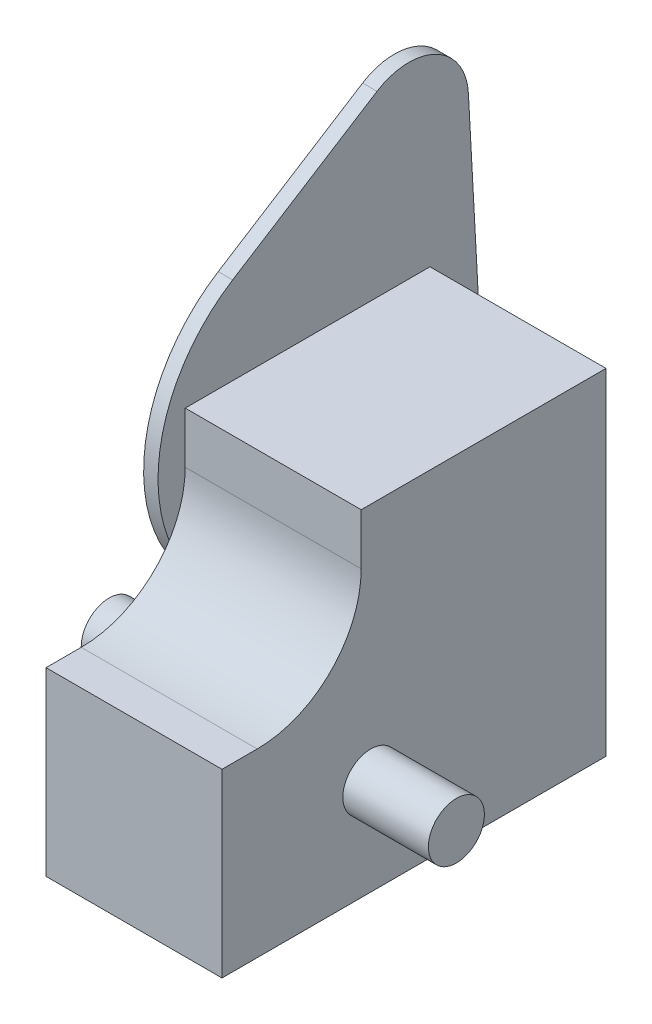
ISO-10303-21;
HEADER;
FILE_DESCRIPTION(('STEP AP214'),'2;1');
FILE_NAME('part.step','',(''),(''),'','','');
FILE_SCHEMA(('AUTOMOTIVE_DESIGN { 1 0 10303 214 1 1 1 1 }'));
ENDSEC;
DATA;
#1=APPLICATION_CONTEXT('core data for automotive mechanical design processes');
#2=APPLICATION_PROTOCOL_DEFINITION('international standard','automotive_design',2000,#1);
#3=PRODUCT_CONTEXT('',#1,'mechanical');
#4=PRODUCT('Part','Part','',(#3));
#5=PRODUCT_RELATED_PRODUCT_CATEGORY('part','',(#4));
#6=PRODUCT_DEFINITION_FORMATION('','',#4);
#7=PRODUCT_DEFINITION_CONTEXT('part definition',#1,'design');
#8=PRODUCT_DEFINITION('design','',#6,#7);
#9=PRODUCT_DEFINITION_SHAPE('','',#8);
#10=(LENGTH_UNIT() NAMED_UNIT(*) SI_UNIT(.MILLI.,.METRE.));
#11=(NAMED_UNIT(*) PLANE_ANGLE_UNIT() SI_UNIT($,.RADIAN.));
#12=(NAMED_UNIT(*) SI_UNIT($,.STERADIAN.) SOLID_ANGLE_UNIT());
#13=UNCERTAINTY_MEASURE_WITH_UNIT(LENGTH_MEASURE(1.E-05),#10,'distance_accuracy_value','');
#14=(GEOMETRIC_REPRESENTATION_CONTEXT(3) GLOBAL_UNCERTAINTY_ASSIGNED_CONTEXT((#13)) GLOBAL_UNIT_ASSIGNED_CONTEXT((#10,
#11,#12)) REPRESENTATION_CONTEXT('',''));
#15=CARTESIAN_POINT('',(0.,0.,0.));
#16=DIRECTION('',(0.,0.,1.));
#17=DIRECTION('',(1.,0.,0.));
#18=AXIS2_PLACEMENT_3D('',#15,#16,#17);
#19=CARTESIAN_POINT('',(-16.256,52.5370403146509,72.4658639167141));
#20=DIRECTION('',(1.,0.,0.));
#21=DIRECTION('',(0.,0.,-1.));
#22=AXIS2_PLACEMENT_3D('',#19,#20,#21);
#23=CYLINDRICAL_SURFACE('',#22,9.46944659375978);
#24=CARTESIAN_POINT('',(-13.97,52.5370403146509,72.4658639167141));
#25=DIRECTION('',(-1.,0.,0.));
#26=DIRECTION('',(0.,0.,1.));
#27=AXIS2_PLACEMENT_3D('',#24,#25,#26);
#28=CIRCLE('',#27,9.46944659375978);
#29=CARTESIAN_POINT('',(-13.97,60.5449521952128,77.5199480182328));
#30=VERTEX_POINT('',#29);
#31=CARTESIAN_POINT('',(-13.97,53.055826511997,63.010638923436));
#32=VERTEX_POINT('',#31);
#33=EDGE_CURVE('E102',#30,#32,#28,.T.);
#34=ORIENTED_EDGE('',*,*,#33,.T.);
#35=DIRECTION('',(1.,0.,0.));
#36=VECTOR('',#35,1.);
#37=CARTESIAN_POINT('',(-16.256,53.055826511997,63.010638923436));
#38=LINE('',#37,#36);
#39=CARTESIAN_POINT('',(-16.256,53.055826511997,63.010638923436));
#40=VERTEX_POINT('',#39);
#41=EDGE_CURVE('E12',#40,#32,#38,.T.);
#42=ORIENTED_EDGE('',*,*,#41,.F.);
#43=CARTESIAN_POINT('',(-16.256,52.5370403146509,72.4658639167141));
#44=DIRECTION('',(-1.,0.,0.));
#45=DIRECTION('',(0.,0.,1.));
#46=AXIS2_PLACEMENT_3D('',#43,#44,#45);
#47=CIRCLE('',#46,9.46944659375978);
#48=CARTESIAN_POINT('',(-16.256,60.5449521952128,77.5199480182328));
#49=VERTEX_POINT('',#48);
#50=EDGE_CURVE('E90',#49,#40,#47,.T.);
#51=ORIENTED_EDGE('',*,*,#50,.F.);
#52=DIRECTION('',(1.,0.,0.));
#53=VECTOR('',#52,1.);
#54=CARTESIAN_POINT('',(-16.256,60.5449521952128,77.5199480182328));
#55=LINE('',#54,#53);
#56=EDGE_CURVE('E98',#49,#30,#55,.T.);
#57=ORIENTED_EDGE('',*,*,#56,.T.);
#58=EDGE_LOOP('',(#34,#42,#51,#57));
#59=FACE_BOUND('',#58,.T.);
#60=ADVANCED_FACE('F39',(#59),#23,.T.);
#61=CARTESIAN_POINT('',(-16.256,53.055826511997,63.010638923436));
#62=DIRECTION('',(0.,-0.0547852709458148,0.998498159280924));
#63=DIRECTION('',(0.,-0.998498159280924,-0.0547852709458148));
#64=AXIS2_PLACEMENT_3D('',#61,#62,#63);
#65=PLANE('',#64);
#66=DIRECTION('',(0.,-0.998498159280924,-0.0547852709458148));
#67=VECTOR('',#66,1.);
#68=CARTESIAN_POINT('',(-13.97,53.055826511997,63.010638923436));
#69=LINE('',#68,#67);
#70=CARTESIAN_POINT('',(-13.97,25.9885861966746,61.525522420569));
#71=VERTEX_POINT('',#70);
#72=EDGE_CURVE('E94',#32,#71,#69,.T.);
#73=ORIENTED_EDGE('',*,*,#72,.T.);
#74=DIRECTION('',(1.,0.,0.));
#75=VECTOR('',#74,1.);
#76=CARTESIAN_POINT('',(-16.256,25.9885861966746,61.525522420569));
#77=LINE('',#76,#75);
#78=CARTESIAN_POINT('',(-16.256,25.9885861966746,61.525522420569));
#79=VERTEX_POINT('',#78);
#80=EDGE_CURVE('E47',#79,#71,#77,.T.);
#81=ORIENTED_EDGE('',*,*,#80,.F.);
#82=DIRECTION('',(0.,-0.998498159280924,-0.0547852709458148));
#83=VECTOR('',#82,1.);
#84=CARTESIAN_POINT('',(-16.256,53.055826511997,63.010638923436));
#85=LINE('',#84,#83);
#86=EDGE_CURVE('E85',#40,#79,#85,.T.);
#87=ORIENTED_EDGE('',*,*,#86,.F.);
#88=ORIENTED_EDGE('',*,*,#41,.T.);
#89=EDGE_LOOP('',(#73,#81,#87,#88));
#90=FACE_BOUND('',#89,.T.);
#91=ADVANCED_FACE('F93',(#90),#65,.F.);
#92=CARTESIAN_POINT('',(-16.256,24.5970403146509,86.8873756663045));
#93=DIRECTION('',(1.,0.,0.));
#94=DIRECTION('',(0.,0.,-1.));
#95=AXIS2_PLACEMENT_3D('',#92,#93,#94);
#96=CYLINDRICAL_SURFACE('',#95,25.4);
#97=CARTESIAN_POINT('',(-13.97,24.5970403146509,86.8873756663045));
#98=DIRECTION('',(-1.,0.,0.));
#99=DIRECTION('',(0.,0.,1.));
#100=AXIS2_PLACEMENT_3D('',#97,#98,#99);
#101=CIRCLE('',#100,25.4);
#102=CARTESIAN_POINT('',(-13.97,46.0767497942218,100.444000639845));
#103=VERTEX_POINT('',#102);
#104=EDGE_CURVE('E72',#71,#103,#101,.T.);
#105=ORIENTED_EDGE('',*,*,#104,.T.);
#106=DIRECTION('',(1.,0.,0.));
#107=VECTOR('',#106,1.);
#108=CARTESIAN_POINT('',(-16.256,46.0767497942218,100.444000639845));
#109=LINE('',#108,#107);
#110=CARTESIAN_POINT('',(-16.256,46.0767497942218,100.444000639845));
#111=VERTEX_POINT('',#110);
#112=EDGE_CURVE('E95',#111,#103,#109,.T.);
#113=ORIENTED_EDGE('',*,*,#112,.F.);
#114=CARTESIAN_POINT('',(-16.256,24.5970403146509,86.8873756663045));
#115=DIRECTION('',(-1.,0.,0.));
#116=DIRECTION('',(0.,0.,1.));
#117=AXIS2_PLACEMENT_3D('',#114,#115,#116);
#118=CIRCLE('',#117,25.4);
#119=EDGE_CURVE('E88',#79,#111,#118,.T.);
#120=ORIENTED_EDGE('',*,*,#119,.F.);
#121=ORIENTED_EDGE('',*,*,#80,.T.);
#122=EDGE_LOOP('',(#105,#113,#120,#121));
#123=FACE_BOUND('',#122,.T.);
#124=ADVANCED_FACE('F96',(#123),#96,.T.);
#125=CARTESIAN_POINT('',(-16.256,60.5449521952128,77.5199480182328));
#126=DIRECTION('',(0.,-0.845657853526414,-0.533725392659089));
#127=DIRECTION('',(0.,0.533725392659089,-0.845657853526414));
#128=AXIS2_PLACEMENT_3D('',#125,#126,#127);
#129=PLANE('',#128);
#130=DIRECTION('',(0.,0.533725392659089,-0.845657853526414));
#131=VECTOR('',#130,1.);
#132=CARTESIAN_POINT('',(-13.97,60.5449521952128,77.5199480182328));
#133=LINE('',#132,#131);
#134=EDGE_CURVE('E78',#103,#30,#133,.T.);
#135=ORIENTED_EDGE('',*,*,#134,.T.);
#136=ORIENTED_EDGE('',*,*,#56,.F.);
#137=DIRECTION('',(0.,0.533725392659089,-0.845657853526414));
#138=VECTOR('',#137,1.);
#139=CARTESIAN_POINT('',(-16.256,60.5449521952128,77.5199480182328));
#140=LINE('',#139,#138);
#141=EDGE_CURVE('E55',#111,#49,#140,.T.);
#142=ORIENTED_EDGE('',*,*,#141,.F.);
#143=ORIENTED_EDGE('',*,*,#112,.T.);
#144=EDGE_LOOP('',(#135,#136,#142,#143));
#145=FACE_BOUND('',#144,.T.);
#146=ADVANCED_FACE('F109',(#145),#129,.F.);
#147=CARTESIAN_POINT('',(-16.256,52.5370403146509,72.4658639167141));
#148=DIRECTION('',(-1.,0.,0.));
#149=DIRECTION('',(0.,0.,1.));
#150=AXIS2_PLACEMENT_3D('',#147,#148,#149);
#151=PLANE('',#150);
#152=ORIENTED_EDGE('',*,*,#50,.T.);
#153=ORIENTED_EDGE('',*,*,#86,.T.);
#154=ORIENTED_EDGE('',*,*,#119,.T.);
#155=ORIENTED_EDGE('',*,*,#141,.T.);
#156=EDGE_LOOP('',(#152,#153,#154,#155));
#157=FACE_BOUND('',#156,.T.);
#158=ADVANCED_FACE('F86',(#157),#151,.T.);
#159=CARTESIAN_POINT('',(-13.97,52.5370403146509,72.4658639167141));
#160=DIRECTION('',(-1.,0.,0.));
#161=DIRECTION('',(0.,0.,1.));
#162=AXIS2_PLACEMENT_3D('',#159,#160,#161);
#163=PLANE('',#162);
#164=ORIENTED_EDGE('',*,*,#33,.F.);
#165=ORIENTED_EDGE('',*,*,#134,.F.);
#166=ORIENTED_EDGE('',*,*,#104,.F.);
#167=ORIENTED_EDGE('',*,*,#72,.F.);
#168=EDGE_LOOP('',(#164,#165,#166,#167));
#169=FACE_BOUND('',#168,.T.);
#170=ADVANCED_FACE('F112',(#169),#163,.F.);
#171=CLOSED_SHELL('',(#60,#91,#124,#146,#158,#170));
#172=MANIFOLD_SOLID_BREP('B2',#171);
#173=CARTESIAN_POINT('',(27.559,-5.88295968534907,106.445375666304));
#174=DIRECTION('',(-1.,0.,0.));
#175=DIRECTION('',(0.,0.,1.));
#176=AXIS2_PLACEMENT_3D('',#173,#174,#175);
#177=CYLINDRICAL_SURFACE('',#176,4.445);
#178=CARTESIAN_POINT('',(27.559,-5.88295968534907,106.445375666304));
#179=DIRECTION('',(1.,0.,0.));
#180=DIRECTION('',(0.,0.,-1.));
#181=AXIS2_PLACEMENT_3D('',#178,#179,#180);
#182=CIRCLE('',#181,4.445);
#183=CARTESIAN_POINT('',(27.559,-5.88295968534907,110.890375666304));
#184=VERTEX_POINT('',#183);
#185=EDGE_CURVE('E38',#184,#184,#182,.T.);
#186=CARTESIAN_POINT('',(-27.559,-5.88295968534907,106.445375666304));
#187=DIRECTION('',(1.,0.,0.));
#188=DIRECTION('',(0.,0.,-1.));
#189=AXIS2_PLACEMENT_3D('',#186,#187,#188);
#190=CIRCLE('',#189,4.445);
#191=CARTESIAN_POINT('',(-27.559,-5.88295968534907,110.890375666304));
#192=VERTEX_POINT('',#191);
#193=EDGE_CURVE('E174',#192,#192,#190,.T.);
#194=CARTESIAN_POINT('',(27.559,-5.88295968534907,110.890375666304));
#195=CARTESIAN_POINT('',(26.9848541666667,-5.88295968534907,110.890375666304));
#196=CARTESIAN_POINT('',(26.4107083333333,-5.88295968534907,110.890375666304));
#197=CARTESIAN_POINT('',(25.2624166666667,-5.88295968534907,110.890375666304));
#198=CARTESIAN_POINT('',(24.6882708333333,-5.88295968534907,110.890375666304));
#199=CARTESIAN_POINT('',(23.5399791666667,-5.88295968534907,110.890375666304));
#200=CARTESIAN_POINT('',(22.9658333333333,-5.88295968534907,110.890375666304));
#201=CARTESIAN_POINT('',(21.8175416666667,-5.88295968534907,110.890375666304));
#202=CARTESIAN_POINT('',(21.2433958333333,-5.88295968534907,110.890375666304));
#203=CARTESIAN_POINT('',(20.0951041666667,-5.88295968534907,110.890375666304));
#204=CARTESIAN_POINT('',(19.5209583333333,-5.88295968534907,110.890375666304));
#205=CARTESIAN_POINT('',(18.3726666666667,-5.88295968534907,110.890375666304));
#206=CARTESIAN_POINT('',(17.7985208333333,-5.88295968534907,110.890375666304));
#207=CARTESIAN_POINT('',(16.6502291666667,-5.88295968534907,110.890375666304));
#208=CARTESIAN_POINT('',(16.0760833333333,-5.88295968534907,110.890375666304));
#209=CARTESIAN_POINT('',(14.9277916666667,-5.88295968534907,110.890375666304));
#210=CARTESIAN_POINT('',(14.3536458333333,-5.88295968534907,110.890375666304));
#211=CARTESIAN_POINT('',(13.2053541666667,-5.88295968534907,110.890375666304));
#212=CARTESIAN_POINT('',(12.6312083333333,-5.88295968534907,110.890375666304));
#213=CARTESIAN_POINT('',(11.4829166666667,-5.88295968534907,110.890375666304));
#214=CARTESIAN_POINT('',(10.9087708333333,-5.88295968534907,110.890375666304));
#215=CARTESIAN_POINT('',(9.76047916666666,-5.88295968534907,110.890375666304));
#216=CARTESIAN_POINT('',(9.18633333333333,-5.88295968534907,110.890375666304));
#217=CARTESIAN_POINT('',(8.03804166666666,-5.88295968534907,110.890375666304));
#218=CARTESIAN_POINT('',(7.46389583333333,-5.88295968534907,110.890375666304));
#219=CARTESIAN_POINT('',(6.31560416666666,-5.88295968534907,110.890375666304));
#220=CARTESIAN_POINT('',(5.74145833333333,-5.88295968534907,110.890375666304));
#221=CARTESIAN_POINT('',(4.59316666666666,-5.88295968534907,110.890375666304));
#222=CARTESIAN_POINT('',(4.01902083333333,-5.88295968534907,110.890375666304));
#223=CARTESIAN_POINT('',(2.87072916666666,-5.88295968534907,110.890375666304));
#224=CARTESIAN_POINT('',(2.29658333333333,-5.88295968534907,110.890375666304));
#225=CARTESIAN_POINT('',(1.14829166666666,-5.88295968534907,110.890375666304));
#226=CARTESIAN_POINT('',(0.57414583333333,-5.88295968534907,110.890375666304));
#227=CARTESIAN_POINT('',(-0.574145833333337,-5.88295968534907,110.890375666304));
#228=CARTESIAN_POINT('',(-1.14829166666667,-5.88295968534907,110.890375666304));
#229=CARTESIAN_POINT('',(-2.29658333333334,-5.88295968534907,110.890375666304));
#230=CARTESIAN_POINT('',(-2.87072916666667,-5.88295968534907,110.890375666304));
#231=CARTESIAN_POINT('',(-4.01902083333333,-5.88295968534907,110.890375666304));
#232=CARTESIAN_POINT('',(-4.59316666666667,-5.88295968534907,110.890375666304));
#233=CARTESIAN_POINT('',(-5.74145833333333,-5.88295968534907,110.890375666304));
#234=CARTESIAN_POINT('',(-6.31560416666666,-5.88295968534907,110.890375666304));
#235=CARTESIAN_POINT('',(-7.46389583333333,-5.88295968534907,110.890375666304));
#236=CARTESIAN_POINT('',(-8.03804166666666,-5.88295968534907,110.890375666304));
#237=CARTESIAN_POINT('',(-9.18633333333333,-5.88295968534907,110.890375666304));
#238=CARTESIAN_POINT('',(-9.76047916666666,-5.88295968534907,110.890375666304));
#239=CARTESIAN_POINT('',(-10.9087708333333,-5.88295968534907,110.890375666304));
#240=CARTESIAN_POINT('',(-11.4829166666667,-5.88295968534907,110.890375666304));
#241=CARTESIAN_POINT('',(-12.6312083333333,-5.88295968534907,110.890375666304));
#242=CARTESIAN_POINT('',(-13.2053541666667,-5.88295968534907,110.890375666304));
#243=CARTESIAN_POINT('',(-14.3536458333333,-5.88295968534907,110.890375666304));
#244=CARTESIAN_POINT('',(-14.9277916666667,-5.88295968534907,110.890375666304));
#245=CARTESIAN_POINT('',(-16.0760833333333,-5.88295968534907,110.890375666304));
#246=CARTESIAN_POINT('',(-16.6502291666667,-5.88295968534907,110.890375666304));
#247=CARTESIAN_POINT('',(-17.7985208333333,-5.88295968534907,110.890375666304));
#248=CARTESIAN_POINT('',(-18.3726666666667,-5.88295968534907,110.890375666304));
#249=CARTESIAN_POINT('',(-19.5209583333333,-5.88295968534907,110.890375666304));
#250=CARTESIAN_POINT('',(-20.0951041666667,-5.88295968534907,110.890375666304));
#251=CARTESIAN_POINT('',(-21.2433958333333,-5.88295968534907,110.890375666304));
#252=CARTESIAN_POINT('',(-21.8175416666667,-5.88295968534907,110.890375666304));
#253=CARTESIAN_POINT('',(-22.9658333333333,-5.88295968534907,110.890375666304));
#254=CARTESIAN_POINT('',(-23.5399791666667,-5.88295968534907,110.890375666304));
#255=CARTESIAN_POINT('',(-24.6882708333333,-5.88295968534907,110.890375666304));
#256=CARTESIAN_POINT('',(-25.2624166666667,-5.88295968534907,110.890375666304));
#257=CARTESIAN_POINT('',(-26.4107083333333,-5.88295968534907,110.890375666304));
#258=CARTESIAN_POINT('',(-26.9848541666667,-5.88295968534907,110.890375666304));
#259=CARTESIAN_POINT('',(-27.559,-5.88295968534907,110.890375666304));
#260=B_SPLINE_CURVE_WITH_KNOTS('',3,(#194,#195,#196,#197,#198,#199,#200,#201,#202,#203,#204,
#205,#206,#207,#208,#209,#210,#211,#212,#213,#214,#215,#216,#217,#218,#219,#220,#221,#222,#223,
#224,#225,#226,#227,#228,#229,#230,#231,#232,#233,#234,#235,#236,#237,#238,#239,#240,#241,#242,
#243,#244,#245,#246,#247,#248,#249,#250,#251,#252,#253,#254,#255,#256,#257,#258,#259),
.UNSPECIFIED.,.F.,.F.,(4,2,2,2,2,2,2,2,2,2,2,2,2,2,2,2,2,2,2,2,2,2,2,2,2,2,2,2,2,2,2,2,4),(0.,
1.7224375,3.444875,5.1673125,6.88975,8.6121875,10.334625,12.0570625,13.7795,15.5019375,
17.224375,18.9468125,20.66925,22.3916875,24.114125,25.8365625,27.559,29.2814375,31.003875,
32.7263125,34.44875,36.1711875,37.893625,39.6160625,41.3385,43.0609375,44.783375,46.5058125,
48.22825,49.9506875,51.673125,53.3955625,55.118),.UNSPECIFIED.);
#261=EDGE_CURVE('BSEAM171',#184,#192,#260,.T.);
#262=ORIENTED_EDGE('',*,*,#185,.F.);
#263=ORIENTED_EDGE('',*,*,#193,.T.);
#264=ORIENTED_EDGE('',*,*,#261,.T.);
#265=ORIENTED_EDGE('',*,*,#261,.F.);
#266=EDGE_LOOP('',(#262,#264,#263,#265));
#267=FACE_BOUND('',#266,.T.);
#268=ADVANCED_FACE('F171',(#267),#177,.T.);
#269=CARTESIAN_POINT('',(27.559,-5.88295968534907,106.445375666304));
#270=DIRECTION('',(1.,0.,0.));
#271=DIRECTION('',(0.,0.,-1.));
#272=AXIS2_PLACEMENT_3D('',#269,#270,#271);
#273=PLANE('',#272);
#274=ORIENTED_EDGE('',*,*,#185,.T.);
#275=EDGE_LOOP('',(#274));
#276=FACE_BOUND('',#275,.T.);
#277=ADVANCED_FACE('F186',(#276),#273,.T.);
#278=CARTESIAN_POINT('',(-27.559,-5.88295968534907,106.445375666304));
#279=DIRECTION('',(1.,0.,0.));
#280=DIRECTION('',(0.,0.,-1.));
#281=AXIS2_PLACEMENT_3D('',#278,#279,#280);
#282=PLANE('',#281);
#283=ORIENTED_EDGE('',*,*,#193,.F.);
#284=EDGE_LOOP('',(#283));
#285=FACE_BOUND('',#284,.T.);
#286=ADVANCED_FACE('F184',(#285),#282,.F.);
#287=CLOSED_SHELL('',(#268,#277,#286));
#288=MANIFOLD_SOLID_BREP('B6',#287);
#289=CARTESIAN_POINT('',(13.97,-21.1229596853491,130.067375666304));
#290=DIRECTION('',(0.,0.,-1.));
#291=DIRECTION('',(-1.,0.,0.));
#292=AXIS2_PLACEMENT_3D('',#289,#290,#291);
#293=PLANE('',#292);
#294=DIRECTION('',(0.,-1.,0.));
#295=VECTOR('',#294,1.);
#296=CARTESIAN_POINT('',(-13.97,-21.1229596853491,130.067375666304));
#297=LINE('',#296,#295);
#298=CARTESIAN_POINT('',(-13.97,7.57904031465093,130.067375666304));
#299=VERTEX_POINT('',#298);
#300=CARTESIAN_POINT('',(-13.97,-21.1229596853491,130.067375666304));
#301=VERTEX_POINT('',#300);
#302=EDGE_CURVE('E301',#299,#301,#297,.T.);
#303=ORIENTED_EDGE('',*,*,#302,.T.);
#304=DIRECTION('',(-1.,0.,0.));
#305=VECTOR('',#304,1.);
#306=CARTESIAN_POINT('',(13.97,-21.1229596853491,130.067375666304));
#307=LINE('',#306,#305);
#308=CARTESIAN_POINT('',(13.97,-21.1229596853491,130.067375666304));
#309=VERTEX_POINT('',#308);
#310=EDGE_CURVE('E169',#309,#301,#307,.T.);
#311=ORIENTED_EDGE('',*,*,#310,.F.);
#312=DIRECTION('',(0.,-1.,0.));
#313=VECTOR('',#312,1.);
#314=CARTESIAN_POINT('',(13.97,-21.1229596853491,130.067375666304));
#315=LINE('',#314,#313);
#316=CARTESIAN_POINT('',(13.97,7.57904031465093,130.067375666304));
#317=VERTEX_POINT('',#316);
#318=EDGE_CURVE('E313',#317,#309,#315,.T.);
#319=ORIENTED_EDGE('',*,*,#318,.F.);
#320=DIRECTION('',(-1.,0.,0.));
#321=VECTOR('',#320,1.);
#322=CARTESIAN_POINT('',(13.97,7.57904031465093,130.067375666304));
#323=LINE('',#322,#321);
#324=EDGE_CURVE('E297',#317,#299,#323,.T.);
#325=ORIENTED_EDGE('',*,*,#324,.T.);
#326=EDGE_LOOP('',(#303,#311,#319,#325));
#327=FACE_BOUND('',#326,.T.);
#328=ADVANCED_FACE('F211',(#327),#293,.F.);
#329=CARTESIAN_POINT('',(13.97,-21.1229596853491,130.067375666304));
#330=DIRECTION('',(0.,1.,0.));
#331=DIRECTION('',(0.,0.,1.));
#332=AXIS2_PLACEMENT_3D('',#329,#330,#331);
#333=PLANE('',#332);
#334=DIRECTION('',(0.,0.,-1.));
#335=VECTOR('',#334,1.);
#336=CARTESIAN_POINT('',(-13.97,-21.1229596853491,130.067375666304));
#337=LINE('',#336,#335);
#338=CARTESIAN_POINT('',(-13.97,-21.1229596853491,69.1073756663044));
#339=VERTEX_POINT('',#338);
#340=EDGE_CURVE('E304',#301,#339,#337,.T.);
#341=ORIENTED_EDGE('',*,*,#340,.T.);
#342=DIRECTION('',(-1.,0.,0.));
#343=VECTOR('',#342,1.);
#344=CARTESIAN_POINT('',(13.97,-21.1229596853491,69.1073756663044));
#345=LINE('',#344,#343);
#346=CARTESIAN_POINT('',(13.97,-21.1229596853491,69.1073756663044));
#347=VERTEX_POINT('',#346);
#348=EDGE_CURVE('E219',#347,#339,#345,.T.);
#349=ORIENTED_EDGE('',*,*,#348,.F.);
#350=DIRECTION('',(0.,0.,-1.));
#351=VECTOR('',#350,1.);
#352=CARTESIAN_POINT('',(13.97,-21.1229596853491,130.067375666304));
#353=LINE('',#352,#351);
#354=EDGE_CURVE('E267',#309,#347,#353,.T.);
#355=ORIENTED_EDGE('',*,*,#354,.F.);
#356=ORIENTED_EDGE('',*,*,#310,.T.);
#357=EDGE_LOOP('',(#341,#349,#355,#356));
#358=FACE_BOUND('',#357,.T.);
#359=ADVANCED_FACE('F338',(#358),#333,.F.);
#360=CARTESIAN_POINT('',(13.97,-21.1229596853491,69.1073756663044));
#361=DIRECTION('',(0.,0.,1.));
#362=DIRECTION('',(1.,0.,0.));
#363=AXIS2_PLACEMENT_3D('',#360,#361,#362);
#364=PLANE('',#363);
#365=DIRECTION('',(0.,1.,0.));
#366=VECTOR('',#365,1.);
#367=CARTESIAN_POINT('',(-13.97,-21.1229596853491,69.1073756663044));
#368=LINE('',#367,#366);
#369=CARTESIAN_POINT('',(-13.97,32.2170403146509,69.1073756663044));
#370=VERTEX_POINT('',#369);
#371=EDGE_CURVE('E306',#339,#370,#368,.T.);
#372=ORIENTED_EDGE('',*,*,#371,.T.);
#373=DIRECTION('',(-1.,0.,0.));
#374=VECTOR('',#373,1.);
#375=CARTESIAN_POINT('',(13.97,32.2170403146509,69.1073756663044));
#376=LINE('',#375,#374);
#377=CARTESIAN_POINT('',(13.97,32.2170403146509,69.1073756663044));
#378=VERTEX_POINT('',#377);
#379=EDGE_CURVE('E317',#378,#370,#376,.T.);
#380=ORIENTED_EDGE('',*,*,#379,.F.);
#381=DIRECTION('',(0.,1.,0.));
#382=VECTOR('',#381,1.);
#383=CARTESIAN_POINT('',(13.97,-21.1229596853491,69.1073756663044));
#384=LINE('',#383,#382);
#385=EDGE_CURVE('E325',#347,#378,#384,.T.);
#386=ORIENTED_EDGE('',*,*,#385,.F.);
#387=ORIENTED_EDGE('',*,*,#348,.T.);
#388=EDGE_LOOP('',(#372,#380,#386,#387));
#389=FACE_BOUND('',#388,.T.);
#390=ADVANCED_FACE('F323',(#389),#364,.F.);
#391=CARTESIAN_POINT('',(13.97,32.2170403146509,69.1073756663044));
#392=DIRECTION('',(0.,-1.,0.));
#393=DIRECTION('',(0.,0.,-1.));
#394=AXIS2_PLACEMENT_3D('',#391,#392,#393);
#395=PLANE('',#394);
#396=DIRECTION('',(0.,0.,1.));
#397=VECTOR('',#396,1.);
#398=CARTESIAN_POINT('',(-13.97,32.2170403146509,69.1073756663044));
#399=LINE('',#398,#397);
#400=CARTESIAN_POINT('',(-13.97,32.2170403146509,107.969375666304));
#401=VERTEX_POINT('',#400);
#402=EDGE_CURVE('E308',#370,#401,#399,.T.);
#403=ORIENTED_EDGE('',*,*,#402,.T.);
#404=DIRECTION('',(-1.,0.,0.));
#405=VECTOR('',#404,1.);
#406=CARTESIAN_POINT('',(13.97,32.2170403146509,107.969375666304));
#407=LINE('',#406,#405);
#408=CARTESIAN_POINT('',(13.97,32.2170403146509,107.969375666304));
#409=VERTEX_POINT('',#408);
#410=EDGE_CURVE('E292',#409,#401,#407,.T.);
#411=ORIENTED_EDGE('',*,*,#410,.F.);
#412=DIRECTION('',(0.,0.,1.));
#413=VECTOR('',#412,1.);
#414=CARTESIAN_POINT('',(13.97,32.2170403146509,69.1073756663044));
#415=LINE('',#414,#413);
#416=EDGE_CURVE('E283',#378,#409,#415,.T.);
#417=ORIENTED_EDGE('',*,*,#416,.F.);
#418=ORIENTED_EDGE('',*,*,#379,.T.);
#419=EDGE_LOOP('',(#403,#411,#417,#418));
#420=FACE_BOUND('',#419,.T.);
#421=ADVANCED_FACE('F331',(#420),#395,.F.);
#422=CARTESIAN_POINT('',(13.97,32.2170403146509,107.969375666304));
#423=DIRECTION('',(0.,0.,-1.));
#424=DIRECTION('',(-1.,0.,0.));
#425=AXIS2_PLACEMENT_3D('',#422,#423,#424);
#426=PLANE('',#425);
#427=DIRECTION('',(0.,-1.,0.));
#428=VECTOR('',#427,1.);
#429=CARTESIAN_POINT('',(-13.97,32.2170403146509,107.969375666304));
#430=LINE('',#429,#428);
#431=CARTESIAN_POINT('',(-13.97,24.089040314651,107.969375666304));
#432=VERTEX_POINT('',#431);
#433=EDGE_CURVE('E291',#401,#432,#430,.T.);
#434=ORIENTED_EDGE('',*,*,#433,.T.);
#435=DIRECTION('',(-1.,0.,0.));
#436=VECTOR('',#435,1.);
#437=CARTESIAN_POINT('',(13.97,24.089040314651,107.969375666304));
#438=LINE('',#437,#436);
#439=CARTESIAN_POINT('',(13.97,24.089040314651,107.969375666304));
#440=VERTEX_POINT('',#439);
#441=EDGE_CURVE('E288',#440,#432,#438,.T.);
#442=ORIENTED_EDGE('',*,*,#441,.F.);
#443=DIRECTION('',(0.,-1.,0.));
#444=VECTOR('',#443,1.);
#445=CARTESIAN_POINT('',(13.97,32.2170403146509,107.969375666304));
#446=LINE('',#445,#444);
#447=EDGE_CURVE('E277',#409,#440,#446,.T.);
#448=ORIENTED_EDGE('',*,*,#447,.F.);
#449=ORIENTED_EDGE('',*,*,#410,.T.);
#450=EDGE_LOOP('',(#434,#442,#448,#449));
#451=FACE_BOUND('',#450,.T.);
#452=ADVANCED_FACE('F289',(#451),#426,.F.);
#453=CARTESIAN_POINT('',(13.97,24.0890403146509,124.479375666304));
#454=DIRECTION('',(-1.,0.,0.));
#455=DIRECTION('',(0.,0.,1.));
#456=AXIS2_PLACEMENT_3D('',#453,#454,#455);
#457=CYLINDRICAL_SURFACE('',#456,16.51);
#458=CARTESIAN_POINT('',(-13.97,24.0890403146509,124.479375666304));
#459=DIRECTION('',(-1.,0.,0.));
#460=DIRECTION('',(0.,0.,-1.));
#461=AXIS2_PLACEMENT_3D('',#458,#459,#460);
#462=CIRCLE('',#461,16.51);
#463=CARTESIAN_POINT('',(-13.97,7.57904031465093,124.479375666305));
#464=VERTEX_POINT('',#463);
#465=EDGE_CURVE('E253',#432,#464,#462,.T.);
#466=ORIENTED_EDGE('',*,*,#465,.T.);
#467=DIRECTION('',(-1.,0.,0.));
#468=VECTOR('',#467,1.);
#469=CARTESIAN_POINT('',(13.97,7.57904031465093,124.479375666305));
#470=LINE('',#469,#468);
#471=CARTESIAN_POINT('',(13.97,7.57904031465093,124.479375666305));
#472=VERTEX_POINT('',#471);
#473=EDGE_CURVE('E293',#472,#464,#470,.T.);
#474=ORIENTED_EDGE('',*,*,#473,.F.);
#475=CARTESIAN_POINT('',(13.97,24.0890403146509,124.479375666304));
#476=DIRECTION('',(-1.,0.,0.));
#477=DIRECTION('',(0.,0.,-1.));
#478=AXIS2_PLACEMENT_3D('',#475,#476,#477);
#479=CIRCLE('',#478,16.51);
#480=EDGE_CURVE('E281',#440,#472,#479,.T.);
#481=ORIENTED_EDGE('',*,*,#480,.F.);
#482=ORIENTED_EDGE('',*,*,#441,.T.);
#483=EDGE_LOOP('',(#466,#474,#481,#482));
#484=FACE_BOUND('',#483,.T.);
#485=ADVANCED_FACE('F295',(#484),#457,.F.);
#486=CARTESIAN_POINT('',(13.97,7.57904031465093,130.067375666304));
#487=DIRECTION('',(0.,-1.,0.));
#488=DIRECTION('',(0.,0.,-1.));
#489=AXIS2_PLACEMENT_3D('',#486,#487,#488);
#490=PLANE('',#489);
#491=DIRECTION('',(0.,0.,1.));
#492=VECTOR('',#491,1.);
#493=CARTESIAN_POINT('',(-13.97,7.57904031465093,130.067375666304));
#494=LINE('',#493,#492);
#495=EDGE_CURVE('E259',#464,#299,#494,.T.);
#496=ORIENTED_EDGE('',*,*,#495,.T.);
#497=ORIENTED_EDGE('',*,*,#324,.F.);
#498=DIRECTION('',(0.,0.,1.));
#499=VECTOR('',#498,1.);
#500=CARTESIAN_POINT('',(13.97,7.57904031465093,130.067375666304));
#501=LINE('',#500,#499);
#502=EDGE_CURVE('E227',#472,#317,#501,.T.);
#503=ORIENTED_EDGE('',*,*,#502,.F.);
#504=ORIENTED_EDGE('',*,*,#473,.T.);
#505=EDGE_LOOP('',(#496,#497,#503,#504));
#506=FACE_BOUND('',#505,.T.);
#507=ADVANCED_FACE('F352',(#506),#490,.F.);
#508=CARTESIAN_POINT('',(13.97,24.0890403146509,124.479375666304));
#509=DIRECTION('',(1.,0.,0.));
#510=DIRECTION('',(0.,0.,-1.));
#511=AXIS2_PLACEMENT_3D('',#508,#509,#510);
#512=PLANE('',#511);
#513=ORIENTED_EDGE('',*,*,#318,.T.);
#514=ORIENTED_EDGE('',*,*,#354,.T.);
#515=ORIENTED_EDGE('',*,*,#385,.T.);
#516=ORIENTED_EDGE('',*,*,#416,.T.);
#517=ORIENTED_EDGE('',*,*,#447,.T.);
#518=ORIENTED_EDGE('',*,*,#480,.T.);
#519=ORIENTED_EDGE('',*,*,#502,.T.);
#520=EDGE_LOOP('',(#513,#514,#515,#516,#517,#518,#519));
#521=FACE_BOUND('',#520,.T.);
#522=ADVANCED_FACE('F279',(#521),#512,.T.);
#523=CARTESIAN_POINT('',(-13.97,24.0890403146509,124.479375666304));
#524=DIRECTION('',(1.,0.,0.));
#525=DIRECTION('',(0.,0.,-1.));
#526=AXIS2_PLACEMENT_3D('',#523,#524,#525);
#527=PLANE('',#526);
#528=ORIENTED_EDGE('',*,*,#302,.F.);
#529=ORIENTED_EDGE('',*,*,#495,.F.);
#530=ORIENTED_EDGE('',*,*,#465,.F.);
#531=ORIENTED_EDGE('',*,*,#433,.F.);
#532=ORIENTED_EDGE('',*,*,#402,.F.);
#533=ORIENTED_EDGE('',*,*,#371,.F.);
#534=ORIENTED_EDGE('',*,*,#340,.F.);
#535=EDGE_LOOP('',(#528,#529,#530,#531,#532,#533,#534));
#536=FACE_BOUND('',#535,.T.);
#537=ADVANCED_FACE('F329',(#536),#527,.F.);
#538=CLOSED_SHELL('',(#328,#359,#390,#421,#452,#485,#507,#522,#537));
#539=MANIFOLD_SOLID_BREP('B33',#538);
#540=ADVANCED_BREP_SHAPE_REPRESENTATION('',(#18,#172,#288,#539),#14);
#541=SHAPE_DEFINITION_REPRESENTATION(#9,#540);
ENDSEC;
END-ISO-10303-21;
